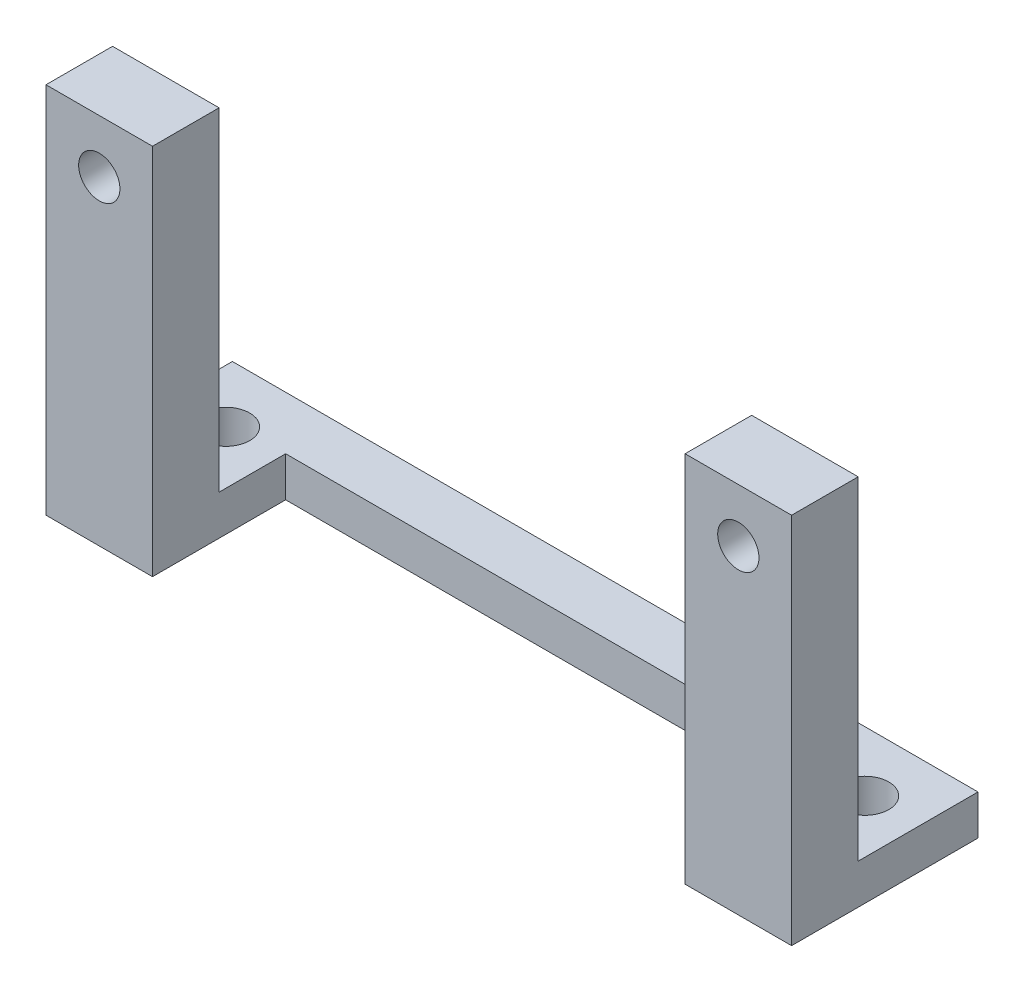
ISO-10303-21;
HEADER;
FILE_DESCRIPTION(('STEP AP214'),'2;1');
FILE_NAME('part.step','',(''),(''),'','','');
FILE_SCHEMA(('AUTOMOTIVE_DESIGN { 1 0 10303 214 1 1 1 1 }'));
ENDSEC;
DATA;
#1=APPLICATION_CONTEXT('core data for automotive mechanical design processes');
#2=APPLICATION_PROTOCOL_DEFINITION('international standard','automotive_design',2000,#1);
#3=PRODUCT_CONTEXT('',#1,'mechanical');
#4=PRODUCT('Part','Part','',(#3));
#5=PRODUCT_RELATED_PRODUCT_CATEGORY('part','',(#4));
#6=PRODUCT_DEFINITION_FORMATION('','',#4);
#7=PRODUCT_DEFINITION_CONTEXT('part definition',#1,'design');
#8=PRODUCT_DEFINITION('design','',#6,#7);
#9=PRODUCT_DEFINITION_SHAPE('','',#8);
#10=(LENGTH_UNIT() NAMED_UNIT(*) SI_UNIT(.MILLI.,.METRE.));
#11=(NAMED_UNIT(*) PLANE_ANGLE_UNIT() SI_UNIT($,.RADIAN.));
#12=(NAMED_UNIT(*) SI_UNIT($,.STERADIAN.) SOLID_ANGLE_UNIT());
#13=UNCERTAINTY_MEASURE_WITH_UNIT(LENGTH_MEASURE(1.E-05),#10,'distance_accuracy_value','');
#14=(GEOMETRIC_REPRESENTATION_CONTEXT(3) GLOBAL_UNCERTAINTY_ASSIGNED_CONTEXT((#13)) GLOBAL_UNIT_ASSIGNED_CONTEXT((#10,
#11,#12)) REPRESENTATION_CONTEXT('',''));
#15=CARTESIAN_POINT('',(0.,0.,0.));
#16=DIRECTION('',(0.,0.,1.));
#17=DIRECTION('',(1.,0.,0.));
#18=AXIS2_PLACEMENT_3D('',#15,#16,#17);
#19=CARTESIAN_POINT('',(0.,3.,0.));
#20=DIRECTION('',(0.,-1.,0.));
#21=DIRECTION('',(0.,0.,-1.));
#22=AXIS2_PLACEMENT_3D('',#19,#20,#21);
#23=PLANE('',#22);
#24=CARTESIAN_POINT('',(-24.,3.,-4.5));
#25=DIRECTION('',(0.,1.,0.));
#26=DIRECTION('',(0.,0.,1.));
#27=AXIS2_PLACEMENT_3D('',#24,#25,#26);
#28=CIRCLE('',#27,1.8);
#29=CARTESIAN_POINT('',(-24.,3.,-2.7));
#30=VERTEX_POINT('',#29);
#31=EDGE_CURVE('E431',#30,#30,#28,.T.);
#32=ORIENTED_EDGE('',*,*,#31,.F.);
#33=EDGE_LOOP('',(#32));
#34=FACE_BOUND('',#33,.T.);
#35=CARTESIAN_POINT('',(24.,3.,-4.5));
#36=DIRECTION('',(0.,1.,0.));
#37=DIRECTION('',(0.,0.,1.));
#38=AXIS2_PLACEMENT_3D('',#35,#36,#37);
#39=CIRCLE('',#38,1.8);
#40=CARTESIAN_POINT('',(24.,3.,-2.7));
#41=VERTEX_POINT('',#40);
#42=EDGE_CURVE('E425',#41,#41,#39,.T.);
#43=ORIENTED_EDGE('',*,*,#42,.F.);
#44=EDGE_LOOP('',(#43));
#45=FACE_BOUND('',#44,.T.);
#46=DIRECTION('',(1.,0.,0.));
#47=VECTOR('',#46,1.);
#48=CARTESIAN_POINT('',(20.,3.,0.));
#49=LINE('',#48,#47);
#50=CARTESIAN_POINT('',(20.,3.,0.));
#51=VERTEX_POINT('',#50);
#52=CARTESIAN_POINT('',(28.,3.,0.));
#53=VERTEX_POINT('',#52);
#54=EDGE_CURVE('E158',#51,#53,#49,.T.);
#55=ORIENTED_EDGE('',*,*,#54,.T.);
#56=DIRECTION('',(0.,0.,-1.));
#57=VECTOR('',#56,1.);
#58=CARTESIAN_POINT('',(28.,3.,-9.));
#59=LINE('',#58,#57);
#60=CARTESIAN_POINT('',(28.,3.,-9.));
#61=VERTEX_POINT('',#60);
#62=EDGE_CURVE('E205',#53,#61,#59,.T.);
#63=ORIENTED_EDGE('',*,*,#62,.T.);
#64=DIRECTION('',(-1.,0.,0.));
#65=VECTOR('',#64,1.);
#66=CARTESIAN_POINT('',(-28.,3.,-9.));
#67=LINE('',#66,#65);
#68=CARTESIAN_POINT('',(-28.,3.,-9.));
#69=VERTEX_POINT('',#68);
#70=EDGE_CURVE('E208',#61,#69,#67,.T.);
#71=ORIENTED_EDGE('',*,*,#70,.T.);
#72=DIRECTION('',(0.,0.,1.));
#73=VECTOR('',#72,1.);
#74=CARTESIAN_POINT('',(-28.,3.,5.));
#75=LINE('',#74,#73);
#76=CARTESIAN_POINT('',(-28.,3.,0.));
#77=VERTEX_POINT('',#76);
#78=EDGE_CURVE('E202',#69,#77,#75,.T.);
#79=ORIENTED_EDGE('',*,*,#78,.T.);
#80=DIRECTION('',(1.,0.,0.));
#81=VECTOR('',#80,1.);
#82=CARTESIAN_POINT('',(-28.,3.,0.));
#83=LINE('',#82,#81);
#84=CARTESIAN_POINT('',(-20.,3.,0.));
#85=VERTEX_POINT('',#84);
#86=EDGE_CURVE('E170',#77,#85,#83,.T.);
#87=ORIENTED_EDGE('',*,*,#86,.T.);
#88=DIRECTION('',(0.,0.,1.));
#89=VECTOR('',#88,1.);
#90=CARTESIAN_POINT('',(-20.,3.,-5.));
#91=LINE('',#90,#89);
#92=CARTESIAN_POINT('',(-20.,3.,-5.));
#93=VERTEX_POINT('',#92);
#94=EDGE_CURVE('E180',#93,#85,#91,.T.);
#95=ORIENTED_EDGE('',*,*,#94,.F.);
#96=DIRECTION('',(-1.,0.,0.));
#97=VECTOR('',#96,1.);
#98=CARTESIAN_POINT('',(20.,3.,-5.));
#99=LINE('',#98,#97);
#100=CARTESIAN_POINT('',(20.,3.,-5.));
#101=VERTEX_POINT('',#100);
#102=EDGE_CURVE('E186',#101,#93,#99,.T.);
#103=ORIENTED_EDGE('',*,*,#102,.F.);
#104=DIRECTION('',(0.,0.,-1.));
#105=VECTOR('',#104,1.);
#106=CARTESIAN_POINT('',(20.,3.,6.));
#107=LINE('',#106,#105);
#108=EDGE_CURVE('E183',#51,#101,#107,.T.);
#109=ORIENTED_EDGE('',*,*,#108,.F.);
#110=EDGE_LOOP('',(#55,#63,#71,#79,#87,#95,#103,#109));
#111=FACE_BOUND('',#110,.T.);
#112=ADVANCED_FACE('F35',(#34,#45,#111),#23,.F.);
#113=CARTESIAN_POINT('',(28.,3.,5.));
#114=DIRECTION('',(0.,0.,-1.));
#115=DIRECTION('',(-1.,0.,0.));
#116=AXIS2_PLACEMENT_3D('',#113,#114,#115);
#117=PLANE('',#116);
#118=CARTESIAN_POINT('',(-24.,24.,5.));
#119=DIRECTION('',(0.,0.,1.));
#120=DIRECTION('',(1.,0.,0.));
#121=AXIS2_PLACEMENT_3D('',#118,#119,#120);
#122=CIRCLE('',#121,1.55);
#123=CARTESIAN_POINT('',(-22.45,24.,5.));
#124=VERTEX_POINT('',#123);
#125=EDGE_CURVE('E159',#124,#124,#122,.T.);
#126=ORIENTED_EDGE('',*,*,#125,.F.);
#127=EDGE_LOOP('',(#126));
#128=FACE_BOUND('',#127,.T.);
#129=DIRECTION('',(0.,-1.,0.));
#130=VECTOR('',#129,1.);
#131=CARTESIAN_POINT('',(-20.,3.,5.));
#132=LINE('',#131,#130);
#133=CARTESIAN_POINT('',(-20.,28.,5.));
#134=VERTEX_POINT('',#133);
#135=CARTESIAN_POINT('',(-20.,0.,5.));
#136=VERTEX_POINT('',#135);
#137=EDGE_CURVE('E199',#134,#136,#132,.T.);
#138=ORIENTED_EDGE('',*,*,#137,.F.);
#139=DIRECTION('',(-1.,0.,0.));
#140=VECTOR('',#139,1.);
#141=CARTESIAN_POINT('',(-20.,28.,5.));
#142=LINE('',#141,#140);
#143=CARTESIAN_POINT('',(-28.,28.,5.));
#144=VERTEX_POINT('',#143);
#145=EDGE_CURVE('E163',#134,#144,#142,.T.);
#146=ORIENTED_EDGE('',*,*,#145,.T.);
#147=DIRECTION('',(0.,-1.,0.));
#148=VECTOR('',#147,1.);
#149=CARTESIAN_POINT('',(-28.,3.,5.));
#150=LINE('',#149,#148);
#151=CARTESIAN_POINT('',(-28.,0.,5.));
#152=VERTEX_POINT('',#151);
#153=EDGE_CURVE('E43',#144,#152,#150,.T.);
#154=ORIENTED_EDGE('',*,*,#153,.T.);
#155=DIRECTION('',(1.,0.,0.));
#156=VECTOR('',#155,1.);
#157=CARTESIAN_POINT('',(28.,0.,5.));
#158=LINE('',#157,#156);
#159=EDGE_CURVE('E213',#152,#136,#158,.T.);
#160=ORIENTED_EDGE('',*,*,#159,.T.);
#161=EDGE_LOOP('',(#138,#146,#154,#160));
#162=FACE_BOUND('',#161,.T.);
#163=ADVANCED_FACE('F224',(#128,#162),#117,.F.);
#164=CARTESIAN_POINT('',(24.,24.,5.));
#165=DIRECTION('',(0.,0.,1.));
#166=DIRECTION('',(1.,0.,0.));
#167=AXIS2_PLACEMENT_3D('',#164,#165,#166);
#168=CIRCLE('',#167,1.55);
#169=CARTESIAN_POINT('',(25.55,24.,5.));
#170=VERTEX_POINT('',#169);
#171=EDGE_CURVE('E416',#170,#170,#168,.T.);
#172=ORIENTED_EDGE('',*,*,#171,.F.);
#173=EDGE_LOOP('',(#172));
#174=FACE_BOUND('',#173,.T.);
#175=DIRECTION('',(0.,1.,0.));
#176=VECTOR('',#175,1.);
#177=CARTESIAN_POINT('',(20.,3.,5.));
#178=LINE('',#177,#176);
#179=CARTESIAN_POINT('',(20.,0.,5.));
#180=VERTEX_POINT('',#179);
#181=CARTESIAN_POINT('',(20.,28.,5.));
#182=VERTEX_POINT('',#181);
#183=EDGE_CURVE('E197',#180,#182,#178,.T.);
#184=ORIENTED_EDGE('',*,*,#183,.F.);
#185=CARTESIAN_POINT('',(28.,0.,5.));
#186=VERTEX_POINT('',#185);
#187=EDGE_CURVE('E133',#180,#186,#158,.T.);
#188=ORIENTED_EDGE('',*,*,#187,.T.);
#189=DIRECTION('',(0.,-1.,0.));
#190=VECTOR('',#189,1.);
#191=CARTESIAN_POINT('',(28.,3.,5.));
#192=LINE('',#191,#190);
#193=CARTESIAN_POINT('',(28.,28.,5.));
#194=VERTEX_POINT('',#193);
#195=EDGE_CURVE('E125',#194,#186,#192,.T.);
#196=ORIENTED_EDGE('',*,*,#195,.F.);
#197=DIRECTION('',(-1.,0.,0.));
#198=VECTOR('',#197,1.);
#199=CARTESIAN_POINT('',(28.,28.,5.));
#200=LINE('',#199,#198);
#201=EDGE_CURVE('E130',#194,#182,#200,.T.);
#202=ORIENTED_EDGE('',*,*,#201,.T.);
#203=EDGE_LOOP('',(#184,#188,#196,#202));
#204=FACE_BOUND('',#203,.T.);
#205=ADVANCED_FACE('F128',(#174,#204),#117,.F.);
#206=CARTESIAN_POINT('',(0.,0.,0.));
#207=DIRECTION('',(0.,-1.,0.));
#208=DIRECTION('',(0.,0.,-1.));
#209=AXIS2_PLACEMENT_3D('',#206,#207,#208);
#210=PLANE('',#209);
#211=CARTESIAN_POINT('',(-24.,0.,-4.5));
#212=DIRECTION('',(0.,1.,0.));
#213=DIRECTION('',(0.,0.,1.));
#214=AXIS2_PLACEMENT_3D('',#211,#212,#213);
#215=CIRCLE('',#214,1.8);
#216=CARTESIAN_POINT('',(-24.,0.,-2.7));
#217=VERTEX_POINT('',#216);
#218=EDGE_CURVE('E428',#217,#217,#215,.T.);
#219=ORIENTED_EDGE('',*,*,#218,.T.);
#220=EDGE_LOOP('',(#219));
#221=FACE_BOUND('',#220,.T.);
#222=CARTESIAN_POINT('',(24.,0.,-4.5));
#223=DIRECTION('',(0.,1.,0.));
#224=DIRECTION('',(0.,0.,1.));
#225=AXIS2_PLACEMENT_3D('',#222,#223,#224);
#226=CIRCLE('',#225,1.8);
#227=CARTESIAN_POINT('',(24.,0.,-2.7));
#228=VERTEX_POINT('',#227);
#229=EDGE_CURVE('E422',#228,#228,#226,.T.);
#230=ORIENTED_EDGE('',*,*,#229,.T.);
#231=EDGE_LOOP('',(#230));
#232=FACE_BOUND('',#231,.T.);
#233=DIRECTION('',(-1.,0.,0.));
#234=VECTOR('',#233,1.);
#235=CARTESIAN_POINT('',(20.,0.,-5.));
#236=LINE('',#235,#234);
#237=CARTESIAN_POINT('',(20.,0.,-5.));
#238=VERTEX_POINT('',#237);
#239=CARTESIAN_POINT('',(-20.,0.,-5.));
#240=VERTEX_POINT('',#239);
#241=EDGE_CURVE('E184',#238,#240,#236,.T.);
#242=ORIENTED_EDGE('',*,*,#241,.T.);
#243=DIRECTION('',(0.,0.,1.));
#244=VECTOR('',#243,1.);
#245=CARTESIAN_POINT('',(-20.,0.,-5.));
#246=LINE('',#245,#244);
#247=EDGE_CURVE('E179',#240,#136,#246,.T.);
#248=ORIENTED_EDGE('',*,*,#247,.T.);
#249=ORIENTED_EDGE('',*,*,#159,.F.);
#250=DIRECTION('',(0.,0.,1.));
#251=VECTOR('',#250,1.);
#252=CARTESIAN_POINT('',(-28.,0.,5.));
#253=LINE('',#252,#251);
#254=CARTESIAN_POINT('',(-28.,0.,-9.));
#255=VERTEX_POINT('',#254);
#256=EDGE_CURVE('E201',#255,#152,#253,.T.);
#257=ORIENTED_EDGE('',*,*,#256,.F.);
#258=DIRECTION('',(-1.,0.,0.));
#259=VECTOR('',#258,1.);
#260=CARTESIAN_POINT('',(-28.,0.,-9.));
#261=LINE('',#260,#259);
#262=CARTESIAN_POINT('',(28.,0.,-9.));
#263=VERTEX_POINT('',#262);
#264=EDGE_CURVE('E206',#263,#255,#261,.T.);
#265=ORIENTED_EDGE('',*,*,#264,.F.);
#266=DIRECTION('',(0.,0.,-1.));
#267=VECTOR('',#266,1.);
#268=CARTESIAN_POINT('',(28.,0.,-9.));
#269=LINE('',#268,#267);
#270=EDGE_CURVE('E216',#186,#263,#269,.T.);
#271=ORIENTED_EDGE('',*,*,#270,.F.);
#272=ORIENTED_EDGE('',*,*,#187,.F.);
#273=DIRECTION('',(0.,0.,-1.));
#274=VECTOR('',#273,1.);
#275=CARTESIAN_POINT('',(20.,0.,0.));
#276=LINE('',#275,#274);
#277=EDGE_CURVE('E11',#180,#238,#276,.T.);
#278=ORIENTED_EDGE('',*,*,#277,.T.);
#279=EDGE_LOOP('',(#242,#248,#249,#257,#265,#271,#272,#278));
#280=FACE_BOUND('',#279,.T.);
#281=ADVANCED_FACE('F233',(#221,#232,#280),#210,.T.);
#282=CARTESIAN_POINT('',(-28.,3.,5.));
#283=DIRECTION('',(1.,0.,0.));
#284=DIRECTION('',(0.,0.,-1.));
#285=AXIS2_PLACEMENT_3D('',#282,#283,#284);
#286=PLANE('',#285);
#287=ORIENTED_EDGE('',*,*,#256,.T.);
#288=ORIENTED_EDGE('',*,*,#153,.F.);
#289=DIRECTION('',(0.,0.,-1.));
#290=VECTOR('',#289,1.);
#291=CARTESIAN_POINT('',(-28.,28.,5.));
#292=LINE('',#291,#290);
#293=CARTESIAN_POINT('',(-28.,28.,0.));
#294=VERTEX_POINT('',#293);
#295=EDGE_CURVE('E166',#144,#294,#292,.T.);
#296=ORIENTED_EDGE('',*,*,#295,.T.);
#297=DIRECTION('',(0.,-1.,0.));
#298=VECTOR('',#297,1.);
#299=CARTESIAN_POINT('',(-28.,28.,0.));
#300=LINE('',#299,#298);
#301=EDGE_CURVE('E145',#294,#77,#300,.T.);
#302=ORIENTED_EDGE('',*,*,#301,.T.);
#303=ORIENTED_EDGE('',*,*,#78,.F.);
#304=DIRECTION('',(0.,-1.,0.));
#305=VECTOR('',#304,1.);
#306=CARTESIAN_POINT('',(-28.,3.,-9.));
#307=LINE('',#306,#305);
#308=EDGE_CURVE('E210',#69,#255,#307,.T.);
#309=ORIENTED_EDGE('',*,*,#308,.T.);
#310=EDGE_LOOP('',(#287,#288,#296,#302,#303,#309));
#311=FACE_BOUND('',#310,.T.);
#312=ADVANCED_FACE('F37',(#311),#286,.F.);
#313=CARTESIAN_POINT('',(28.,3.,-9.));
#314=DIRECTION('',(-1.,0.,0.));
#315=DIRECTION('',(0.,0.,1.));
#316=AXIS2_PLACEMENT_3D('',#313,#314,#315);
#317=PLANE('',#316);
#318=ORIENTED_EDGE('',*,*,#270,.T.);
#319=DIRECTION('',(0.,-1.,0.));
#320=VECTOR('',#319,1.);
#321=CARTESIAN_POINT('',(28.,3.,-9.));
#322=LINE('',#321,#320);
#323=EDGE_CURVE('E136',#61,#263,#322,.T.);
#324=ORIENTED_EDGE('',*,*,#323,.F.);
#325=ORIENTED_EDGE('',*,*,#62,.F.);
#326=DIRECTION('',(0.,1.,0.));
#327=VECTOR('',#326,1.);
#328=CARTESIAN_POINT('',(28.,3.,0.));
#329=LINE('',#328,#327);
#330=CARTESIAN_POINT('',(28.,28.,0.));
#331=VERTEX_POINT('',#330);
#332=EDGE_CURVE('E142',#53,#331,#329,.T.);
#333=ORIENTED_EDGE('',*,*,#332,.T.);
#334=DIRECTION('',(0.,0.,-1.));
#335=VECTOR('',#334,1.);
#336=CARTESIAN_POINT('',(28.,28.,5.));
#337=LINE('',#336,#335);
#338=EDGE_CURVE('E139',#194,#331,#337,.T.);
#339=ORIENTED_EDGE('',*,*,#338,.F.);
#340=ORIENTED_EDGE('',*,*,#195,.T.);
#341=EDGE_LOOP('',(#318,#324,#325,#333,#339,#340));
#342=FACE_BOUND('',#341,.T.);
#343=ADVANCED_FACE('F140',(#342),#317,.F.);
#344=CARTESIAN_POINT('',(-28.,3.,-9.));
#345=DIRECTION('',(0.,0.,1.));
#346=DIRECTION('',(1.,0.,0.));
#347=AXIS2_PLACEMENT_3D('',#344,#345,#346);
#348=PLANE('',#347);
#349=ORIENTED_EDGE('',*,*,#264,.T.);
#350=ORIENTED_EDGE('',*,*,#308,.F.);
#351=ORIENTED_EDGE('',*,*,#70,.F.);
#352=ORIENTED_EDGE('',*,*,#323,.T.);
#353=EDGE_LOOP('',(#349,#350,#351,#352));
#354=FACE_BOUND('',#353,.T.);
#355=ADVANCED_FACE('F253',(#354),#348,.F.);
#356=CARTESIAN_POINT('',(-20.,3.,-5.));
#357=DIRECTION('',(1.,0.,0.));
#358=DIRECTION('',(0.,0.,-1.));
#359=AXIS2_PLACEMENT_3D('',#356,#357,#358);
#360=PLANE('',#359);
#361=ORIENTED_EDGE('',*,*,#137,.T.);
#362=ORIENTED_EDGE('',*,*,#247,.F.);
#363=DIRECTION('',(0.,-1.,0.));
#364=VECTOR('',#363,1.);
#365=CARTESIAN_POINT('',(-20.,3.,-5.));
#366=LINE('',#365,#364);
#367=EDGE_CURVE('E188',#93,#240,#366,.T.);
#368=ORIENTED_EDGE('',*,*,#367,.F.);
#369=ORIENTED_EDGE('',*,*,#94,.T.);
#370=DIRECTION('',(0.,1.,0.));
#371=VECTOR('',#370,1.);
#372=CARTESIAN_POINT('',(-20.,3.,0.));
#373=LINE('',#372,#371);
#374=CARTESIAN_POINT('',(-20.,28.,0.));
#375=VERTEX_POINT('',#374);
#376=EDGE_CURVE('E58',#85,#375,#373,.T.);
#377=ORIENTED_EDGE('',*,*,#376,.T.);
#378=DIRECTION('',(0.,0.,-1.));
#379=VECTOR('',#378,1.);
#380=CARTESIAN_POINT('',(-20.,28.,5.));
#381=LINE('',#380,#379);
#382=EDGE_CURVE('E176',#134,#375,#381,.T.);
#383=ORIENTED_EDGE('',*,*,#382,.F.);
#384=EDGE_LOOP('',(#361,#362,#368,#369,#377,#383));
#385=FACE_BOUND('',#384,.T.);
#386=ADVANCED_FACE('F237',(#385),#360,.T.);
#387=CARTESIAN_POINT('',(20.,3.,6.));
#388=DIRECTION('',(-1.,0.,0.));
#389=DIRECTION('',(0.,0.,1.));
#390=AXIS2_PLACEMENT_3D('',#387,#388,#389);
#391=PLANE('',#390);
#392=ORIENTED_EDGE('',*,*,#183,.T.);
#393=DIRECTION('',(0.,0.,-1.));
#394=VECTOR('',#393,1.);
#395=CARTESIAN_POINT('',(20.,28.,5.));
#396=LINE('',#395,#394);
#397=CARTESIAN_POINT('',(20.,28.,0.));
#398=VERTEX_POINT('',#397);
#399=EDGE_CURVE('E146',#182,#398,#396,.T.);
#400=ORIENTED_EDGE('',*,*,#399,.T.);
#401=DIRECTION('',(0.,-1.,0.));
#402=VECTOR('',#401,1.);
#403=CARTESIAN_POINT('',(20.,28.,0.));
#404=LINE('',#403,#402);
#405=EDGE_CURVE('E50',#398,#51,#404,.T.);
#406=ORIENTED_EDGE('',*,*,#405,.T.);
#407=ORIENTED_EDGE('',*,*,#108,.T.);
#408=DIRECTION('',(0.,-1.,0.));
#409=VECTOR('',#408,1.);
#410=CARTESIAN_POINT('',(20.,3.,-5.));
#411=LINE('',#410,#409);
#412=EDGE_CURVE('E195',#101,#238,#411,.T.);
#413=ORIENTED_EDGE('',*,*,#412,.T.);
#414=ORIENTED_EDGE('',*,*,#277,.F.);
#415=EDGE_LOOP('',(#392,#400,#406,#407,#413,#414));
#416=FACE_BOUND('',#415,.T.);
#417=ADVANCED_FACE('F254',(#416),#391,.T.);
#418=CARTESIAN_POINT('',(20.,3.,-5.));
#419=DIRECTION('',(0.,0.,1.));
#420=DIRECTION('',(1.,0.,0.));
#421=AXIS2_PLACEMENT_3D('',#418,#419,#420);
#422=PLANE('',#421);
#423=ORIENTED_EDGE('',*,*,#241,.F.);
#424=ORIENTED_EDGE('',*,*,#412,.F.);
#425=ORIENTED_EDGE('',*,*,#102,.T.);
#426=ORIENTED_EDGE('',*,*,#367,.T.);
#427=EDGE_LOOP('',(#423,#424,#425,#426));
#428=FACE_BOUND('',#427,.T.);
#429=ADVANCED_FACE('F241',(#428),#422,.T.);
#430=CARTESIAN_POINT('',(-20.,28.,5.));
#431=DIRECTION('',(0.,-1.,0.));
#432=DIRECTION('',(0.,0.,-1.));
#433=AXIS2_PLACEMENT_3D('',#430,#431,#432);
#434=PLANE('',#433);
#435=DIRECTION('',(-1.,0.,0.));
#436=VECTOR('',#435,1.);
#437=CARTESIAN_POINT('',(-20.,28.,0.));
#438=LINE('',#437,#436);
#439=EDGE_CURVE('E167',#375,#294,#438,.T.);
#440=ORIENTED_EDGE('',*,*,#439,.T.);
#441=ORIENTED_EDGE('',*,*,#295,.F.);
#442=ORIENTED_EDGE('',*,*,#145,.F.);
#443=ORIENTED_EDGE('',*,*,#382,.T.);
#444=EDGE_LOOP('',(#440,#441,#442,#443));
#445=FACE_BOUND('',#444,.T.);
#446=ADVANCED_FACE('F247',(#445),#434,.F.);
#447=CARTESIAN_POINT('',(0.,0.,0.));
#448=DIRECTION('',(0.,0.,1.));
#449=DIRECTION('',(1.,0.,0.));
#450=AXIS2_PLACEMENT_3D('',#447,#448,#449);
#451=PLANE('',#450);
#452=CARTESIAN_POINT('',(-24.,24.,0.));
#453=DIRECTION('',(0.,0.,1.));
#454=DIRECTION('',(1.,0.,0.));
#455=AXIS2_PLACEMENT_3D('',#452,#453,#454);
#456=CIRCLE('',#455,1.55);
#457=CARTESIAN_POINT('',(-22.45,24.,0.));
#458=VERTEX_POINT('',#457);
#459=EDGE_CURVE('E414',#458,#458,#456,.T.);
#460=ORIENTED_EDGE('',*,*,#459,.T.);
#461=EDGE_LOOP('',(#460));
#462=FACE_BOUND('',#461,.T.);
#463=ORIENTED_EDGE('',*,*,#301,.F.);
#464=ORIENTED_EDGE('',*,*,#439,.F.);
#465=ORIENTED_EDGE('',*,*,#376,.F.);
#466=ORIENTED_EDGE('',*,*,#86,.F.);
#467=EDGE_LOOP('',(#463,#464,#465,#466));
#468=FACE_BOUND('',#467,.T.);
#469=ADVANCED_FACE('F249',(#462,#468),#451,.F.);
#470=CARTESIAN_POINT('',(28.,28.,5.));
#471=DIRECTION('',(0.,-1.,0.));
#472=DIRECTION('',(0.,0.,-1.));
#473=AXIS2_PLACEMENT_3D('',#470,#471,#472);
#474=PLANE('',#473);
#475=DIRECTION('',(-1.,0.,0.));
#476=VECTOR('',#475,1.);
#477=CARTESIAN_POINT('',(28.,28.,0.));
#478=LINE('',#477,#476);
#479=EDGE_CURVE('E149',#331,#398,#478,.T.);
#480=ORIENTED_EDGE('',*,*,#479,.T.);
#481=ORIENTED_EDGE('',*,*,#399,.F.);
#482=ORIENTED_EDGE('',*,*,#201,.F.);
#483=ORIENTED_EDGE('',*,*,#338,.T.);
#484=EDGE_LOOP('',(#480,#481,#482,#483));
#485=FACE_BOUND('',#484,.T.);
#486=ADVANCED_FACE('F148',(#485),#474,.F.);
#487=CARTESIAN_POINT('',(0.,0.,0.));
#488=DIRECTION('',(0.,0.,1.));
#489=DIRECTION('',(1.,0.,0.));
#490=AXIS2_PLACEMENT_3D('',#487,#488,#489);
#491=PLANE('',#490);
#492=CARTESIAN_POINT('',(24.,24.,0.));
#493=DIRECTION('',(0.,0.,1.));
#494=DIRECTION('',(1.,0.,0.));
#495=AXIS2_PLACEMENT_3D('',#492,#493,#494);
#496=CIRCLE('',#495,1.55);
#497=CARTESIAN_POINT('',(25.55,24.,0.));
#498=VERTEX_POINT('',#497);
#499=EDGE_CURVE('E155',#498,#498,#496,.T.);
#500=ORIENTED_EDGE('',*,*,#499,.T.);
#501=EDGE_LOOP('',(#500));
#502=FACE_BOUND('',#501,.T.);
#503=ORIENTED_EDGE('',*,*,#405,.F.);
#504=ORIENTED_EDGE('',*,*,#479,.F.);
#505=ORIENTED_EDGE('',*,*,#332,.F.);
#506=ORIENTED_EDGE('',*,*,#54,.F.);
#507=EDGE_LOOP('',(#503,#504,#505,#506));
#508=FACE_BOUND('',#507,.T.);
#509=ADVANCED_FACE('F256',(#502,#508),#491,.F.);
#510=CARTESIAN_POINT('',(24.,24.,5.));
#511=DIRECTION('',(0.,0.,-1.));
#512=DIRECTION('',(-1.,0.,0.));
#513=AXIS2_PLACEMENT_3D('',#510,#511,#512);
#514=CYLINDRICAL_SURFACE('',#513,1.55);
#515=ORIENTED_EDGE('',*,*,#171,.T.);
#516=EDGE_LOOP('',(#515));
#517=FACE_BOUND('',#516,.T.);
#518=ORIENTED_EDGE('',*,*,#499,.F.);
#519=EDGE_LOOP('',(#518));
#520=FACE_BOUND('',#519,.T.);
#521=ADVANCED_FACE('F258',(#517,#520),#514,.F.);
#522=CARTESIAN_POINT('',(-24.,24.,5.));
#523=DIRECTION('',(0.,0.,-1.));
#524=DIRECTION('',(-1.,0.,0.));
#525=AXIS2_PLACEMENT_3D('',#522,#523,#524);
#526=CYLINDRICAL_SURFACE('',#525,1.55);
#527=ORIENTED_EDGE('',*,*,#125,.T.);
#528=EDGE_LOOP('',(#527));
#529=FACE_BOUND('',#528,.T.);
#530=ORIENTED_EDGE('',*,*,#459,.F.);
#531=EDGE_LOOP('',(#530));
#532=FACE_BOUND('',#531,.T.);
#533=ADVANCED_FACE('F265',(#529,#532),#526,.F.);
#534=CARTESIAN_POINT('',(24.,3.,-4.5));
#535=DIRECTION('',(0.,-1.,0.));
#536=DIRECTION('',(0.,0.,-1.));
#537=AXIS2_PLACEMENT_3D('',#534,#535,#536);
#538=CYLINDRICAL_SURFACE('',#537,1.8);
#539=ORIENTED_EDGE('',*,*,#42,.T.);
#540=EDGE_LOOP('',(#539));
#541=FACE_BOUND('',#540,.T.);
#542=ORIENTED_EDGE('',*,*,#229,.F.);
#543=EDGE_LOOP('',(#542));
#544=FACE_BOUND('',#543,.T.);
#545=ADVANCED_FACE('F390',(#541,#544),#538,.F.);
#546=CARTESIAN_POINT('',(-24.,3.,-4.5));
#547=DIRECTION('',(0.,-1.,0.));
#548=DIRECTION('',(0.,0.,-1.));
#549=AXIS2_PLACEMENT_3D('',#546,#547,#548);
#550=CYLINDRICAL_SURFACE('',#549,1.8);
#551=ORIENTED_EDGE('',*,*,#31,.T.);
#552=EDGE_LOOP('',(#551));
#553=FACE_BOUND('',#552,.T.);
#554=ORIENTED_EDGE('',*,*,#218,.F.);
#555=EDGE_LOOP('',(#554));
#556=FACE_BOUND('',#555,.T.);
#557=ADVANCED_FACE('F436',(#553,#556),#550,.F.);
#558=CLOSED_SHELL('',(#112,#163,#205,#281,#312,#343,#355,#386,#417,#429,#446,#469,#486,#509,
#521,#533,#545,#557));
#559=MANIFOLD_SOLID_BREP('B2',#558);
#560=ADVANCED_BREP_SHAPE_REPRESENTATION('',(#18,#559),#14);
#561=SHAPE_DEFINITION_REPRESENTATION(#9,#560);
ENDSEC;
END-ISO-10303-21;
